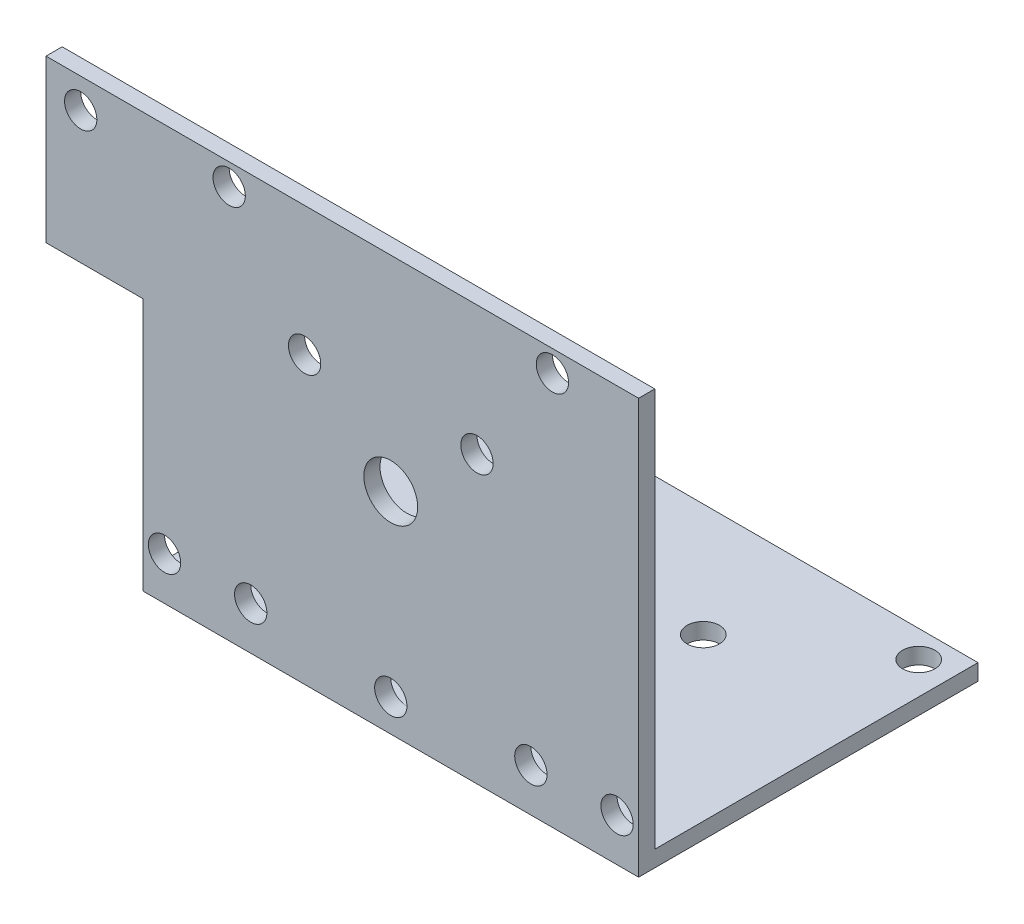
ISO-10303-21;
HEADER;
FILE_DESCRIPTION(('STEP AP214'),'2;1');
FILE_NAME('part.step','',(''),(''),'','','');
FILE_SCHEMA(('AUTOMOTIVE_DESIGN { 1 0 10303 214 1 1 1 1 }'));
ENDSEC;
DATA;
#1=APPLICATION_CONTEXT('core data for automotive mechanical design processes');
#2=APPLICATION_PROTOCOL_DEFINITION('international standard','automotive_design',2000,#1);
#3=PRODUCT_CONTEXT('',#1,'mechanical');
#4=PRODUCT('Part','Part','',(#3));
#5=PRODUCT_RELATED_PRODUCT_CATEGORY('part','',(#4));
#6=PRODUCT_DEFINITION_FORMATION('','',#4);
#7=PRODUCT_DEFINITION_CONTEXT('part definition',#1,'design');
#8=PRODUCT_DEFINITION('design','',#6,#7);
#9=PRODUCT_DEFINITION_SHAPE('','',#8);
#10=(LENGTH_UNIT() NAMED_UNIT(*) SI_UNIT(.MILLI.,.METRE.));
#11=(NAMED_UNIT(*) PLANE_ANGLE_UNIT() SI_UNIT($,.RADIAN.));
#12=(NAMED_UNIT(*) SI_UNIT($,.STERADIAN.) SOLID_ANGLE_UNIT());
#13=UNCERTAINTY_MEASURE_WITH_UNIT(LENGTH_MEASURE(1.E-05),#10,'distance_accuracy_value','');
#14=(GEOMETRIC_REPRESENTATION_CONTEXT(3) GLOBAL_UNCERTAINTY_ASSIGNED_CONTEXT((#13)) GLOBAL_UNIT_ASSIGNED_CONTEXT((#10,
#11,#12)) REPRESENTATION_CONTEXT('',''));
#15=CARTESIAN_POINT('',(0.,0.,0.));
#16=DIRECTION('',(0.,0.,1.));
#17=DIRECTION('',(1.,0.,0.));
#18=AXIS2_PLACEMENT_3D('',#15,#16,#17);
#19=CARTESIAN_POINT('',(23.,-19.25,1.5));
#20=DIRECTION('',(-1.,0.,0.));
#21=DIRECTION('',(0.,0.,1.));
#22=AXIS2_PLACEMENT_3D('',#19,#20,#21);
#23=PLANE('',#22);
#24=DIRECTION('',(0.,0.,-1.));
#25=VECTOR('',#24,1.);
#26=CARTESIAN_POINT('',(23.,-19.25,1.5));
#27=LINE('',#26,#25);
#28=CARTESIAN_POINT('',(23.,-19.25,1.5));
#29=VERTEX_POINT('',#28);
#30=CARTESIAN_POINT('',(23.,-19.25,-30.));
#31=VERTEX_POINT('',#30);
#32=EDGE_CURVE('E123',#29,#31,#27,.T.);
#33=ORIENTED_EDGE('',*,*,#32,.T.);
#34=DIRECTION('',(0.,-1.,0.));
#35=VECTOR('',#34,1.);
#36=CARTESIAN_POINT('',(23.,-19.25,-30.));
#37=LINE('',#36,#35);
#38=CARTESIAN_POINT('',(23.,-17.75,-30.));
#39=VERTEX_POINT('',#38);
#40=EDGE_CURVE('E148',#39,#31,#37,.T.);
#41=ORIENTED_EDGE('',*,*,#40,.F.);
#42=DIRECTION('',(0.,0.,1.));
#43=VECTOR('',#42,1.);
#44=CARTESIAN_POINT('',(23.,-17.75,-30.));
#45=LINE('',#44,#43);
#46=CARTESIAN_POINT('',(23.,-17.75,0.));
#47=VERTEX_POINT('',#46);
#48=EDGE_CURVE('E154',#39,#47,#45,.T.);
#49=ORIENTED_EDGE('',*,*,#48,.T.);
#50=DIRECTION('',(0.,1.,0.));
#51=VECTOR('',#50,1.);
#52=CARTESIAN_POINT('',(23.,-19.25,0.));
#53=LINE('',#52,#51);
#54=CARTESIAN_POINT('',(23.,19.25,0.));
#55=VERTEX_POINT('',#54);
#56=EDGE_CURVE('E129',#47,#55,#53,.T.);
#57=ORIENTED_EDGE('',*,*,#56,.T.);
#58=DIRECTION('',(0.,0.,-1.));
#59=VECTOR('',#58,1.);
#60=CARTESIAN_POINT('',(23.,19.25,1.5));
#61=LINE('',#60,#59);
#62=CARTESIAN_POINT('',(23.,19.25,1.5));
#63=VERTEX_POINT('',#62);
#64=EDGE_CURVE('E11',#63,#55,#61,.T.);
#65=ORIENTED_EDGE('',*,*,#64,.F.);
#66=DIRECTION('',(0.,1.,0.));
#67=VECTOR('',#66,1.);
#68=CARTESIAN_POINT('',(23.,-19.25,1.5));
#69=LINE('',#68,#67);
#70=EDGE_CURVE('E125',#29,#63,#69,.T.);
#71=ORIENTED_EDGE('',*,*,#70,.F.);
#72=EDGE_LOOP('',(#33,#41,#49,#57,#65,#71));
#73=FACE_BOUND('',#72,.T.);
#74=ADVANCED_FACE('F33',(#73),#23,.F.);
#75=CARTESIAN_POINT('',(-23.,19.25,1.5));
#76=DIRECTION('',(0.,-1.,0.));
#77=DIRECTION('',(0.,0.,-1.));
#78=AXIS2_PLACEMENT_3D('',#75,#76,#77);
#79=PLANE('',#78);
#80=DIRECTION('',(-1.,0.,0.));
#81=VECTOR('',#80,1.);
#82=CARTESIAN_POINT('',(-23.,19.25,0.));
#83=LINE('',#82,#81);
#84=CARTESIAN_POINT('',(-32.,19.25,0.));
#85=VERTEX_POINT('',#84);
#86=EDGE_CURVE('E131',#55,#85,#83,.T.);
#87=ORIENTED_EDGE('',*,*,#86,.T.);
#88=DIRECTION('',(0.,0.,-1.));
#89=VECTOR('',#88,1.);
#90=CARTESIAN_POINT('',(-32.,19.25,1.5));
#91=LINE('',#90,#89);
#92=CARTESIAN_POINT('',(-32.,19.25,1.5));
#93=VERTEX_POINT('',#92);
#94=EDGE_CURVE('E173',#93,#85,#91,.T.);
#95=ORIENTED_EDGE('',*,*,#94,.F.);
#96=DIRECTION('',(-1.,0.,0.));
#97=VECTOR('',#96,1.);
#98=CARTESIAN_POINT('',(-23.,19.25,1.5));
#99=LINE('',#98,#97);
#100=EDGE_CURVE('E121',#63,#93,#99,.T.);
#101=ORIENTED_EDGE('',*,*,#100,.F.);
#102=ORIENTED_EDGE('',*,*,#64,.T.);
#103=EDGE_LOOP('',(#87,#95,#101,#102));
#104=FACE_BOUND('',#103,.T.);
#105=ADVANCED_FACE('F171',(#104),#79,.F.);
#106=CARTESIAN_POINT('',(-23.,-19.25,1.5));
#107=DIRECTION('',(1.,0.,0.));
#108=DIRECTION('',(0.,0.,-1.));
#109=AXIS2_PLACEMENT_3D('',#106,#107,#108);
#110=PLANE('',#109);
#111=DIRECTION('',(0.,-1.,0.));
#112=VECTOR('',#111,1.);
#113=CARTESIAN_POINT('',(-23.,-19.25,1.5));
#114=LINE('',#113,#112);
#115=CARTESIAN_POINT('',(-23.,4.25,1.5));
#116=VERTEX_POINT('',#115);
#117=CARTESIAN_POINT('',(-23.,-19.25,1.5));
#118=VERTEX_POINT('',#117);
#119=EDGE_CURVE('E112',#116,#118,#114,.T.);
#120=ORIENTED_EDGE('',*,*,#119,.F.);
#121=DIRECTION('',(0.,0.,-1.));
#122=VECTOR('',#121,1.);
#123=CARTESIAN_POINT('',(-23.,4.25,1.5));
#124=LINE('',#123,#122);
#125=CARTESIAN_POINT('',(-23.,4.25,0.));
#126=VERTEX_POINT('',#125);
#127=EDGE_CURVE('E97',#116,#126,#124,.T.);
#128=ORIENTED_EDGE('',*,*,#127,.T.);
#129=DIRECTION('',(0.,-1.,0.));
#130=VECTOR('',#129,1.);
#131=CARTESIAN_POINT('',(-23.,-19.25,0.));
#132=LINE('',#131,#130);
#133=CARTESIAN_POINT('',(-23.,-17.75,0.));
#134=VERTEX_POINT('',#133);
#135=EDGE_CURVE('E134',#126,#134,#132,.T.);
#136=ORIENTED_EDGE('',*,*,#135,.T.);
#137=DIRECTION('',(0.,0.,1.));
#138=VECTOR('',#137,1.);
#139=CARTESIAN_POINT('',(-23.,-17.75,-30.));
#140=LINE('',#139,#138);
#141=CARTESIAN_POINT('',(-23.,-17.75,-30.));
#142=VERTEX_POINT('',#141);
#143=EDGE_CURVE('E132',#142,#134,#140,.T.);
#144=ORIENTED_EDGE('',*,*,#143,.F.);
#145=DIRECTION('',(0.,1.,0.));
#146=VECTOR('',#145,1.);
#147=CARTESIAN_POINT('',(-23.,-19.25,-30.));
#148=LINE('',#147,#146);
#149=CARTESIAN_POINT('',(-23.,-19.25,-30.));
#150=VERTEX_POINT('',#149);
#151=EDGE_CURVE('E145',#150,#142,#148,.T.);
#152=ORIENTED_EDGE('',*,*,#151,.F.);
#153=DIRECTION('',(0.,0.,-1.));
#154=VECTOR('',#153,1.);
#155=CARTESIAN_POINT('',(-23.,-19.25,1.5));
#156=LINE('',#155,#154);
#157=EDGE_CURVE('E40',#118,#150,#156,.T.);
#158=ORIENTED_EDGE('',*,*,#157,.F.);
#159=EDGE_LOOP('',(#120,#128,#136,#144,#152,#158));
#160=FACE_BOUND('',#159,.T.);
#161=ADVANCED_FACE('F117',(#160),#110,.F.);
#162=CARTESIAN_POINT('',(-23.,-19.25,1.5));
#163=DIRECTION('',(0.,1.,0.));
#164=DIRECTION('',(0.,0.,1.));
#165=AXIS2_PLACEMENT_3D('',#162,#163,#164);
#166=PLANE('',#165);
#167=CARTESIAN_POINT('',(-20.,-19.25,-27.5));
#168=DIRECTION('',(0.,1.,0.));
#169=DIRECTION('',(0.,0.,1.));
#170=AXIS2_PLACEMENT_3D('',#167,#168,#169);
#171=CIRCLE('',#170,1.5);
#172=CARTESIAN_POINT('',(-20.,-19.25,-26.));
#173=VERTEX_POINT('',#172);
#174=EDGE_CURVE('E256',#173,#173,#171,.F.);
#175=ORIENTED_EDGE('',*,*,#174,.F.);
#176=EDGE_LOOP('',(#175));
#177=FACE_BOUND('',#176,.T.);
#178=CARTESIAN_POINT('',(8.,-19.25,-19.5));
#179=DIRECTION('',(0.,1.,0.));
#180=DIRECTION('',(0.,0.,1.));
#181=AXIS2_PLACEMENT_3D('',#178,#179,#180);
#182=CIRCLE('',#181,1.5);
#183=CARTESIAN_POINT('',(8.,-19.25,-18.));
#184=VERTEX_POINT('',#183);
#185=EDGE_CURVE('E262',#184,#184,#182,.F.);
#186=ORIENTED_EDGE('',*,*,#185,.F.);
#187=EDGE_LOOP('',(#186));
#188=FACE_BOUND('',#187,.T.);
#189=CARTESIAN_POINT('',(-8.,-19.25,-4.5));
#190=DIRECTION('',(0.,1.,0.));
#191=DIRECTION('',(0.,0.,1.));
#192=AXIS2_PLACEMENT_3D('',#189,#190,#191);
#193=CIRCLE('',#192,1.5);
#194=CARTESIAN_POINT('',(-8.,-19.25,-3.));
#195=VERTEX_POINT('',#194);
#196=EDGE_CURVE('E263',#195,#195,#193,.F.);
#197=ORIENTED_EDGE('',*,*,#196,.F.);
#198=EDGE_LOOP('',(#197));
#199=FACE_BOUND('',#198,.T.);
#200=CARTESIAN_POINT('',(8.,-19.25,-4.5));
#201=DIRECTION('',(0.,1.,0.));
#202=DIRECTION('',(0.,0.,1.));
#203=AXIS2_PLACEMENT_3D('',#200,#201,#202);
#204=CIRCLE('',#203,1.5);
#205=CARTESIAN_POINT('',(8.,-19.25,-3.00000000000001));
#206=VERTEX_POINT('',#205);
#207=EDGE_CURVE('E248',#206,#206,#204,.F.);
#208=ORIENTED_EDGE('',*,*,#207,.F.);
#209=EDGE_LOOP('',(#208));
#210=FACE_BOUND('',#209,.T.);
#211=CARTESIAN_POINT('',(20.,-19.25,-27.5));
#212=DIRECTION('',(0.,1.,0.));
#213=DIRECTION('',(0.,0.,1.));
#214=AXIS2_PLACEMENT_3D('',#211,#212,#213);
#215=CIRCLE('',#214,1.5);
#216=CARTESIAN_POINT('',(20.,-19.25,-26.));
#217=VERTEX_POINT('',#216);
#218=EDGE_CURVE('E249',#217,#217,#215,.F.);
#219=ORIENTED_EDGE('',*,*,#218,.F.);
#220=EDGE_LOOP('',(#219));
#221=FACE_BOUND('',#220,.T.);
#222=CARTESIAN_POINT('',(-8.,-19.25,-19.5));
#223=DIRECTION('',(0.,1.,0.));
#224=DIRECTION('',(0.,0.,1.));
#225=AXIS2_PLACEMENT_3D('',#222,#223,#224);
#226=CIRCLE('',#225,1.5);
#227=CARTESIAN_POINT('',(-8.,-19.25,-18.));
#228=VERTEX_POINT('',#227);
#229=EDGE_CURVE('E277',#228,#228,#226,.F.);
#230=ORIENTED_EDGE('',*,*,#229,.F.);
#231=EDGE_LOOP('',(#230));
#232=FACE_BOUND('',#231,.T.);
#233=ORIENTED_EDGE('',*,*,#157,.T.);
#234=DIRECTION('',(-1.,0.,0.));
#235=VECTOR('',#234,1.);
#236=CARTESIAN_POINT('',(23.,-19.25,-30.));
#237=LINE('',#236,#235);
#238=EDGE_CURVE('E141',#31,#150,#237,.T.);
#239=ORIENTED_EDGE('',*,*,#238,.F.);
#240=ORIENTED_EDGE('',*,*,#32,.F.);
#241=DIRECTION('',(1.,0.,0.));
#242=VECTOR('',#241,1.);
#243=CARTESIAN_POINT('',(-23.,-19.25,1.5));
#244=LINE('',#243,#242);
#245=EDGE_CURVE('E120',#118,#29,#244,.T.);
#246=ORIENTED_EDGE('',*,*,#245,.F.);
#247=EDGE_LOOP('',(#233,#239,#240,#246));
#248=FACE_BOUND('',#247,.T.);
#249=ADVANCED_FACE('F139',(#177,#188,#199,#210,#221,#232,#248),#166,.F.);
#250=CARTESIAN_POINT('',(0.,0.,1.5));
#251=DIRECTION('',(0.,0.,-1.));
#252=DIRECTION('',(-1.,0.,0.));
#253=AXIS2_PLACEMENT_3D('',#250,#251,#252);
#254=PLANE('',#253);
#255=CARTESIAN_POINT('',(0.,0.250000000000004,1.5));
#256=DIRECTION('',(0.,0.,1.));
#257=DIRECTION('',(1.,0.,0.));
#258=AXIS2_PLACEMENT_3D('',#255,#256,#257);
#259=CIRCLE('',#258,2.5);
#260=CARTESIAN_POINT('',(2.50000000000001,0.250000000000004,1.5));
#261=VERTEX_POINT('',#260);
#262=EDGE_CURVE('E200',#261,#261,#259,.T.);
#263=ORIENTED_EDGE('',*,*,#262,.F.);
#264=EDGE_LOOP('',(#263));
#265=FACE_BOUND('',#264,.T.);
#266=CARTESIAN_POINT('',(8.,7.25000000000001,1.5));
#267=DIRECTION('',(0.,0.,1.));
#268=DIRECTION('',(-1.,0.,0.));
#269=AXIS2_PLACEMENT_3D('',#266,#267,#268);
#270=CIRCLE('',#269,1.5);
#271=CARTESIAN_POINT('',(6.5,7.25000000000001,1.5));
#272=VERTEX_POINT('',#271);
#273=EDGE_CURVE('E193',#272,#272,#270,.T.);
#274=ORIENTED_EDGE('',*,*,#273,.F.);
#275=EDGE_LOOP('',(#274));
#276=FACE_BOUND('',#275,.T.);
#277=CARTESIAN_POINT('',(-8.,7.25,1.5));
#278=DIRECTION('',(0.,0.,1.));
#279=DIRECTION('',(1.,0.,0.));
#280=AXIS2_PLACEMENT_3D('',#277,#278,#279);
#281=CIRCLE('',#280,1.5);
#282=CARTESIAN_POINT('',(-6.5,7.25,1.5));
#283=VERTEX_POINT('',#282);
#284=EDGE_CURVE('E214',#283,#283,#281,.T.);
#285=ORIENTED_EDGE('',*,*,#284,.F.);
#286=EDGE_LOOP('',(#285));
#287=FACE_BOUND('',#286,.T.);
#288=CARTESIAN_POINT('',(15.,17.25,1.5));
#289=DIRECTION('',(0.,0.,1.));
#290=DIRECTION('',(1.,0.,0.));
#291=AXIS2_PLACEMENT_3D('',#288,#289,#290);
#292=CIRCLE('',#291,1.5);
#293=CARTESIAN_POINT('',(16.5,17.25,1.5));
#294=VERTEX_POINT('',#293);
#295=EDGE_CURVE('E207',#294,#294,#292,.T.);
#296=ORIENTED_EDGE('',*,*,#295,.F.);
#297=EDGE_LOOP('',(#296));
#298=FACE_BOUND('',#297,.T.);
#299=CARTESIAN_POINT('',(-13.,-15.25,1.5));
#300=DIRECTION('',(0.,0.,1.));
#301=DIRECTION('',(1.,0.,0.));
#302=AXIS2_PLACEMENT_3D('',#299,#300,#301);
#303=CIRCLE('',#302,1.5);
#304=CARTESIAN_POINT('',(-11.5,-15.25,1.5));
#305=VERTEX_POINT('',#304);
#306=EDGE_CURVE('E226',#305,#305,#303,.T.);
#307=ORIENTED_EDGE('',*,*,#306,.F.);
#308=EDGE_LOOP('',(#307));
#309=FACE_BOUND('',#308,.T.);
#310=CARTESIAN_POINT('',(21.,-15.25,1.5));
#311=DIRECTION('',(0.,0.,1.));
#312=DIRECTION('',(-1.,0.,0.));
#313=AXIS2_PLACEMENT_3D('',#310,#311,#312);
#314=CIRCLE('',#313,1.5);
#315=CARTESIAN_POINT('',(19.5,-15.25,1.5));
#316=VERTEX_POINT('',#315);
#317=EDGE_CURVE('E219',#316,#316,#314,.T.);
#318=ORIENTED_EDGE('',*,*,#317,.F.);
#319=EDGE_LOOP('',(#318));
#320=FACE_BOUND('',#319,.T.);
#321=CARTESIAN_POINT('',(-21.,-15.25,1.5));
#322=DIRECTION('',(0.,0.,1.));
#323=DIRECTION('',(1.,0.,0.));
#324=AXIS2_PLACEMENT_3D('',#321,#322,#323);
#325=CIRCLE('',#324,1.5);
#326=CARTESIAN_POINT('',(-19.5,-15.25,1.5));
#327=VERTEX_POINT('',#326);
#328=EDGE_CURVE('E234',#327,#327,#325,.T.);
#329=ORIENTED_EDGE('',*,*,#328,.F.);
#330=EDGE_LOOP('',(#329));
#331=FACE_BOUND('',#330,.T.);
#332=CARTESIAN_POINT('',(0.,-16.25,1.5));
#333=DIRECTION('',(0.,0.,1.));
#334=DIRECTION('',(1.,0.,0.));
#335=AXIS2_PLACEMENT_3D('',#332,#333,#334);
#336=CIRCLE('',#335,1.5);
#337=CARTESIAN_POINT('',(1.5,-16.25,1.5));
#338=VERTEX_POINT('',#337);
#339=EDGE_CURVE('E206',#338,#338,#336,.T.);
#340=ORIENTED_EDGE('',*,*,#339,.F.);
#341=EDGE_LOOP('',(#340));
#342=FACE_BOUND('',#341,.T.);
#343=CARTESIAN_POINT('',(13.,-15.25,1.5));
#344=DIRECTION('',(0.,0.,1.));
#345=DIRECTION('',(-1.,0.,0.));
#346=AXIS2_PLACEMENT_3D('',#343,#344,#345);
#347=CIRCLE('',#346,1.5);
#348=CARTESIAN_POINT('',(11.5,-15.25,1.5));
#349=VERTEX_POINT('',#348);
#350=EDGE_CURVE('E187',#349,#349,#347,.T.);
#351=ORIENTED_EDGE('',*,*,#350,.F.);
#352=EDGE_LOOP('',(#351));
#353=FACE_BOUND('',#352,.T.);
#354=CARTESIAN_POINT('',(-15.,17.25,1.5));
#355=DIRECTION('',(0.,0.,1.));
#356=DIRECTION('',(1.,0.,0.));
#357=AXIS2_PLACEMENT_3D('',#354,#355,#356);
#358=CIRCLE('',#357,1.5);
#359=CARTESIAN_POINT('',(-13.5,17.25,1.5));
#360=VERTEX_POINT('',#359);
#361=EDGE_CURVE('E239',#360,#360,#358,.T.);
#362=ORIENTED_EDGE('',*,*,#361,.F.);
#363=EDGE_LOOP('',(#362));
#364=FACE_BOUND('',#363,.T.);
#365=ORIENTED_EDGE('',*,*,#70,.T.);
#366=ORIENTED_EDGE('',*,*,#100,.T.);
#367=DIRECTION('',(0.,1.,0.));
#368=VECTOR('',#367,1.);
#369=CARTESIAN_POINT('',(-32.,19.25,1.5));
#370=LINE('',#369,#368);
#371=CARTESIAN_POINT('',(-32.,4.25,1.5));
#372=VERTEX_POINT('',#371);
#373=EDGE_CURVE('E105',#372,#93,#370,.T.);
#374=ORIENTED_EDGE('',*,*,#373,.F.);
#375=DIRECTION('',(-1.,0.,0.));
#376=VECTOR('',#375,1.);
#377=CARTESIAN_POINT('',(-23.,4.25,1.5));
#378=LINE('',#377,#376);
#379=EDGE_CURVE('E100',#116,#372,#378,.T.);
#380=ORIENTED_EDGE('',*,*,#379,.F.);
#381=ORIENTED_EDGE('',*,*,#119,.T.);
#382=ORIENTED_EDGE('',*,*,#245,.T.);
#383=EDGE_LOOP('',(#365,#366,#374,#380,#381,#382));
#384=FACE_BOUND('',#383,.T.);
#385=CARTESIAN_POINT('',(-28.7800000000029,16.5,1.5));
#386=DIRECTION('',(0.,0.,-1.));
#387=DIRECTION('',(-1.,0.,0.));
#388=AXIS2_PLACEMENT_3D('',#385,#386,#387);
#389=CIRCLE('',#388,1.49999999999729);
#390=CARTESIAN_POINT('',(-30.2800000000001,16.5,1.5));
#391=VERTEX_POINT('',#390);
#392=EDGE_CURVE('E184',#391,#391,#389,.T.);
#393=ORIENTED_EDGE('',*,*,#392,.T.);
#394=EDGE_LOOP('',(#393));
#395=FACE_BOUND('',#394,.T.);
#396=ADVANCED_FACE('F110',(#265,#276,#287,#298,#309,#320,#331,#342,#353,#364,#384,#395),#254,.F.);
#397=CARTESIAN_POINT('',(0.,0.,0.));
#398=DIRECTION('',(0.,0.,-1.));
#399=DIRECTION('',(-1.,0.,0.));
#400=AXIS2_PLACEMENT_3D('',#397,#398,#399);
#401=PLANE('',#400);
#402=CARTESIAN_POINT('',(0.,0.250000000000004,0.));
#403=DIRECTION('',(0.,0.,-1.));
#404=DIRECTION('',(-1.,0.,0.));
#405=AXIS2_PLACEMENT_3D('',#402,#403,#404);
#406=CIRCLE('',#405,2.5);
#407=CARTESIAN_POINT('',(-2.49999999999999,0.250000000000004,0.));
#408=VERTEX_POINT('',#407);
#409=EDGE_CURVE('E203',#408,#408,#406,.F.);
#410=ORIENTED_EDGE('',*,*,#409,.T.);
#411=EDGE_LOOP('',(#410));
#412=FACE_BOUND('',#411,.T.);
#413=CARTESIAN_POINT('',(8.,7.25000000000001,0.));
#414=DIRECTION('',(0.,0.,-1.));
#415=DIRECTION('',(-1.,0.,0.));
#416=AXIS2_PLACEMENT_3D('',#413,#414,#415);
#417=CIRCLE('',#416,1.5);
#418=CARTESIAN_POINT('',(6.5,7.25000000000001,0.));
#419=VERTEX_POINT('',#418);
#420=EDGE_CURVE('E197',#419,#419,#417,.F.);
#421=ORIENTED_EDGE('',*,*,#420,.T.);
#422=EDGE_LOOP('',(#421));
#423=FACE_BOUND('',#422,.T.);
#424=CARTESIAN_POINT('',(-8.,7.25,0.));
#425=DIRECTION('',(0.,0.,-1.));
#426=DIRECTION('',(-1.,0.,0.));
#427=AXIS2_PLACEMENT_3D('',#424,#425,#426);
#428=CIRCLE('',#427,1.5);
#429=CARTESIAN_POINT('',(-9.5,7.25,0.));
#430=VERTEX_POINT('',#429);
#431=EDGE_CURVE('E196',#430,#430,#428,.F.);
#432=ORIENTED_EDGE('',*,*,#431,.T.);
#433=EDGE_LOOP('',(#432));
#434=FACE_BOUND('',#433,.T.);
#435=CARTESIAN_POINT('',(15.,17.25,0.));
#436=DIRECTION('',(0.,0.,-1.));
#437=DIRECTION('',(-1.,0.,0.));
#438=AXIS2_PLACEMENT_3D('',#435,#436,#437);
#439=CIRCLE('',#438,1.5);
#440=CARTESIAN_POINT('',(13.5,17.25,0.));
#441=VERTEX_POINT('',#440);
#442=EDGE_CURVE('E211',#441,#441,#439,.F.);
#443=ORIENTED_EDGE('',*,*,#442,.T.);
#444=EDGE_LOOP('',(#443));
#445=FACE_BOUND('',#444,.T.);
#446=CARTESIAN_POINT('',(-13.,-15.25,0.));
#447=DIRECTION('',(0.,0.,-1.));
#448=DIRECTION('',(-1.,0.,0.));
#449=AXIS2_PLACEMENT_3D('',#446,#447,#448);
#450=CIRCLE('',#449,1.5);
#451=CARTESIAN_POINT('',(-14.5,-15.25,0.));
#452=VERTEX_POINT('',#451);
#453=EDGE_CURVE('E190',#452,#452,#450,.F.);
#454=ORIENTED_EDGE('',*,*,#453,.T.);
#455=EDGE_LOOP('',(#454));
#456=FACE_BOUND('',#455,.T.);
#457=CARTESIAN_POINT('',(21.,-15.25,0.));
#458=DIRECTION('',(0.,0.,-1.));
#459=DIRECTION('',(-1.,0.,0.));
#460=AXIS2_PLACEMENT_3D('',#457,#458,#459);
#461=CIRCLE('',#460,1.5);
#462=CARTESIAN_POINT('',(19.5,-15.25,0.));
#463=VERTEX_POINT('',#462);
#464=EDGE_CURVE('E223',#463,#463,#461,.F.);
#465=ORIENTED_EDGE('',*,*,#464,.T.);
#466=EDGE_LOOP('',(#465));
#467=FACE_BOUND('',#466,.T.);
#468=CARTESIAN_POINT('',(-21.,-15.25,0.));
#469=DIRECTION('',(0.,0.,-1.));
#470=DIRECTION('',(-1.,0.,0.));
#471=AXIS2_PLACEMENT_3D('',#468,#469,#470);
#472=CIRCLE('',#471,1.5);
#473=CARTESIAN_POINT('',(-22.5,-15.25,0.));
#474=VERTEX_POINT('',#473);
#475=EDGE_CURVE('E222',#474,#474,#472,.F.);
#476=ORIENTED_EDGE('',*,*,#475,.T.);
#477=EDGE_LOOP('',(#476));
#478=FACE_BOUND('',#477,.T.);
#479=CARTESIAN_POINT('',(13.,-15.25,0.));
#480=DIRECTION('',(0.,0.,-1.));
#481=DIRECTION('',(-1.,0.,0.));
#482=AXIS2_PLACEMENT_3D('',#479,#480,#481);
#483=CIRCLE('',#482,1.5);
#484=CARTESIAN_POINT('',(11.5,-15.25,0.));
#485=VERTEX_POINT('',#484);
#486=EDGE_CURVE('E177',#485,#485,#483,.F.);
#487=ORIENTED_EDGE('',*,*,#486,.T.);
#488=EDGE_LOOP('',(#487));
#489=FACE_BOUND('',#488,.T.);
#490=CARTESIAN_POINT('',(-15.,17.25,0.));
#491=DIRECTION('',(0.,0.,-1.));
#492=DIRECTION('',(-1.,0.,0.));
#493=AXIS2_PLACEMENT_3D('',#490,#491,#492);
#494=CIRCLE('',#493,1.5);
#495=CARTESIAN_POINT('',(-16.5,17.25,0.));
#496=VERTEX_POINT('',#495);
#497=EDGE_CURVE('E210',#496,#496,#494,.F.);
#498=ORIENTED_EDGE('',*,*,#497,.T.);
#499=EDGE_LOOP('',(#498));
#500=FACE_BOUND('',#499,.T.);
#501=DIRECTION('',(1.,0.,0.));
#502=VECTOR('',#501,1.);
#503=CARTESIAN_POINT('',(23.,-17.75,0.));
#504=LINE('',#503,#502);
#505=CARTESIAN_POINT('',(0.,-17.75,0.));
#506=VERTEX_POINT('',#505);
#507=EDGE_CURVE('E161',#506,#47,#504,.T.);
#508=ORIENTED_EDGE('',*,*,#507,.F.);
#509=CARTESIAN_POINT('',(0.,-16.25,0.));
#510=DIRECTION('',(0.,0.,-1.));
#511=DIRECTION('',(-1.,0.,0.));
#512=AXIS2_PLACEMENT_3D('',#509,#510,#511);
#513=CIRCLE('',#512,1.5);
#514=EDGE_CURVE('E53',#506,#506,#513,.F.);
#515=ORIENTED_EDGE('',*,*,#514,.T.);
#516=EDGE_CURVE('E158',#134,#506,#504,.T.);
#517=ORIENTED_EDGE('',*,*,#516,.F.);
#518=ORIENTED_EDGE('',*,*,#135,.F.);
#519=DIRECTION('',(-1.,0.,0.));
#520=VECTOR('',#519,1.);
#521=CARTESIAN_POINT('',(-23.,4.25,0.));
#522=LINE('',#521,#520);
#523=CARTESIAN_POINT('',(-32.,4.25,0.));
#524=VERTEX_POINT('',#523);
#525=EDGE_CURVE('E47',#126,#524,#522,.T.);
#526=ORIENTED_EDGE('',*,*,#525,.T.);
#527=DIRECTION('',(0.,1.,0.));
#528=VECTOR('',#527,1.);
#529=CARTESIAN_POINT('',(-32.,19.25,0.));
#530=LINE('',#529,#528);
#531=EDGE_CURVE('E115',#524,#85,#530,.T.);
#532=ORIENTED_EDGE('',*,*,#531,.T.);
#533=ORIENTED_EDGE('',*,*,#86,.F.);
#534=ORIENTED_EDGE('',*,*,#56,.F.);
#535=EDGE_LOOP('',(#508,#515,#517,#518,#526,#532,#533,#534));
#536=FACE_BOUND('',#535,.T.);
#537=CARTESIAN_POINT('',(-28.7800000000029,16.5,0.));
#538=DIRECTION('',(0.,0.,-1.));
#539=DIRECTION('',(-1.,0.,0.));
#540=AXIS2_PLACEMENT_3D('',#537,#538,#539);
#541=CIRCLE('',#540,1.49999999999729);
#542=CARTESIAN_POINT('',(-30.2800000000001,16.5,0.));
#543=VERTEX_POINT('',#542);
#544=EDGE_CURVE('E294',#543,#543,#541,.T.);
#545=ORIENTED_EDGE('',*,*,#544,.F.);
#546=EDGE_LOOP('',(#545));
#547=FACE_BOUND('',#546,.T.);
#548=ADVANCED_FACE('F287',(#412,#423,#434,#445,#456,#467,#478,#489,#500,#536,#547),#401,.T.);
#549=CARTESIAN_POINT('',(23.,-17.75,-30.));
#550=DIRECTION('',(0.,-1.,0.));
#551=DIRECTION('',(0.,0.,-1.));
#552=AXIS2_PLACEMENT_3D('',#549,#550,#551);
#553=PLANE('',#552);
#554=CARTESIAN_POINT('',(-20.,-17.75,-27.5));
#555=DIRECTION('',(0.,1.,0.));
#556=DIRECTION('',(-1.,0.,0.));
#557=AXIS2_PLACEMENT_3D('',#554,#555,#556);
#558=CIRCLE('',#557,1.5);
#559=CARTESIAN_POINT('',(-21.5,-17.75,-27.5));
#560=VERTEX_POINT('',#559);
#561=EDGE_CURVE('E242',#560,#560,#558,.T.);
#562=ORIENTED_EDGE('',*,*,#561,.F.);
#563=EDGE_LOOP('',(#562));
#564=FACE_BOUND('',#563,.T.);
#565=CARTESIAN_POINT('',(8.,-17.75,-19.5));
#566=DIRECTION('',(0.,1.,0.));
#567=DIRECTION('',(-1.,0.,0.));
#568=AXIS2_PLACEMENT_3D('',#565,#566,#567);
#569=CIRCLE('',#568,1.5);
#570=CARTESIAN_POINT('',(6.5,-17.75,-19.5));
#571=VERTEX_POINT('',#570);
#572=EDGE_CURVE('E259',#571,#571,#569,.T.);
#573=ORIENTED_EDGE('',*,*,#572,.F.);
#574=EDGE_LOOP('',(#573));
#575=FACE_BOUND('',#574,.T.);
#576=CARTESIAN_POINT('',(-8.,-17.75,-4.5));
#577=DIRECTION('',(0.,1.,0.));
#578=DIRECTION('',(-1.,0.,0.));
#579=AXIS2_PLACEMENT_3D('',#576,#577,#578);
#580=CIRCLE('',#579,1.5);
#581=CARTESIAN_POINT('',(-9.5,-17.75,-4.5));
#582=VERTEX_POINT('',#581);
#583=EDGE_CURVE('E252',#582,#582,#580,.T.);
#584=ORIENTED_EDGE('',*,*,#583,.F.);
#585=EDGE_LOOP('',(#584));
#586=FACE_BOUND('',#585,.T.);
#587=CARTESIAN_POINT('',(8.,-17.75,-4.5));
#588=DIRECTION('',(0.,1.,0.));
#589=DIRECTION('',(-1.,0.,0.));
#590=AXIS2_PLACEMENT_3D('',#587,#588,#589);
#591=CIRCLE('',#590,1.5);
#592=CARTESIAN_POINT('',(6.5,-17.75,-4.5));
#593=VERTEX_POINT('',#592);
#594=EDGE_CURVE('E245',#593,#593,#591,.T.);
#595=ORIENTED_EDGE('',*,*,#594,.F.);
#596=EDGE_LOOP('',(#595));
#597=FACE_BOUND('',#596,.T.);
#598=CARTESIAN_POINT('',(20.,-17.75,-27.5));
#599=DIRECTION('',(0.,1.,0.));
#600=DIRECTION('',(-1.,0.,0.));
#601=AXIS2_PLACEMENT_3D('',#598,#599,#600);
#602=CIRCLE('',#601,1.5);
#603=CARTESIAN_POINT('',(18.5,-17.75,-27.5));
#604=VERTEX_POINT('',#603);
#605=EDGE_CURVE('E253',#604,#604,#602,.T.);
#606=ORIENTED_EDGE('',*,*,#605,.F.);
#607=EDGE_LOOP('',(#606));
#608=FACE_BOUND('',#607,.T.);
#609=CARTESIAN_POINT('',(-8.,-17.75,-19.5));
#610=DIRECTION('',(0.,1.,0.));
#611=DIRECTION('',(-1.,0.,0.));
#612=AXIS2_PLACEMENT_3D('',#609,#610,#611);
#613=CIRCLE('',#612,1.5);
#614=CARTESIAN_POINT('',(-9.5,-17.75,-19.5));
#615=VERTEX_POINT('',#614);
#616=EDGE_CURVE('E266',#615,#615,#613,.T.);
#617=ORIENTED_EDGE('',*,*,#616,.F.);
#618=EDGE_LOOP('',(#617));
#619=FACE_BOUND('',#618,.T.);
#620=ORIENTED_EDGE('',*,*,#516,.T.);
#621=ORIENTED_EDGE('',*,*,#507,.T.);
#622=ORIENTED_EDGE('',*,*,#48,.F.);
#623=DIRECTION('',(1.,0.,0.));
#624=VECTOR('',#623,1.);
#625=CARTESIAN_POINT('',(23.,-17.75,-30.));
#626=LINE('',#625,#624);
#627=EDGE_CURVE('E152',#142,#39,#626,.T.);
#628=ORIENTED_EDGE('',*,*,#627,.F.);
#629=ORIENTED_EDGE('',*,*,#143,.T.);
#630=EDGE_LOOP('',(#620,#621,#622,#628,#629));
#631=FACE_BOUND('',#630,.T.);
#632=ADVANCED_FACE('F284',(#564,#575,#586,#597,#608,#619,#631),#553,.F.);
#633=CARTESIAN_POINT('',(0.,0.,-30.));
#634=DIRECTION('',(0.,0.,1.));
#635=DIRECTION('',(1.,0.,0.));
#636=AXIS2_PLACEMENT_3D('',#633,#634,#635);
#637=PLANE('',#636);
#638=ORIENTED_EDGE('',*,*,#40,.T.);
#639=ORIENTED_EDGE('',*,*,#238,.T.);
#640=ORIENTED_EDGE('',*,*,#151,.T.);
#641=ORIENTED_EDGE('',*,*,#627,.T.);
#642=EDGE_LOOP('',(#638,#639,#640,#641));
#643=FACE_BOUND('',#642,.T.);
#644=ADVANCED_FACE('F144',(#643),#637,.F.);
#645=CARTESIAN_POINT('',(-8.,-19.251,-19.5));
#646=DIRECTION('',(0.,1.,0.));
#647=DIRECTION('',(-1.,0.,0.));
#648=AXIS2_PLACEMENT_3D('',#645,#646,#647);
#649=CYLINDRICAL_SURFACE('',#648,1.5);
#650=ORIENTED_EDGE('',*,*,#616,.T.);
#651=EDGE_LOOP('',(#650));
#652=FACE_BOUND('',#651,.T.);
#653=ORIENTED_EDGE('',*,*,#229,.T.);
#654=EDGE_LOOP('',(#653));
#655=FACE_BOUND('',#654,.T.);
#656=ADVANCED_FACE('F328',(#652,#655),#649,.F.);
#657=CARTESIAN_POINT('',(20.,-19.251,-27.5));
#658=DIRECTION('',(0.,1.,0.));
#659=DIRECTION('',(-1.,0.,0.));
#660=AXIS2_PLACEMENT_3D('',#657,#658,#659);
#661=CYLINDRICAL_SURFACE('',#660,1.5);
#662=ORIENTED_EDGE('',*,*,#605,.T.);
#663=EDGE_LOOP('',(#662));
#664=FACE_BOUND('',#663,.T.);
#665=ORIENTED_EDGE('',*,*,#218,.T.);
#666=EDGE_LOOP('',(#665));
#667=FACE_BOUND('',#666,.T.);
#668=ADVANCED_FACE('F331',(#664,#667),#661,.F.);
#669=CARTESIAN_POINT('',(8.,-19.251,-4.5));
#670=DIRECTION('',(0.,1.,0.));
#671=DIRECTION('',(-1.,0.,0.));
#672=AXIS2_PLACEMENT_3D('',#669,#670,#671);
#673=CYLINDRICAL_SURFACE('',#672,1.5);
#674=ORIENTED_EDGE('',*,*,#594,.T.);
#675=EDGE_LOOP('',(#674));
#676=FACE_BOUND('',#675,.T.);
#677=ORIENTED_EDGE('',*,*,#207,.T.);
#678=EDGE_LOOP('',(#677));
#679=FACE_BOUND('',#678,.T.);
#680=ADVANCED_FACE('F342',(#676,#679),#673,.F.);
#681=CARTESIAN_POINT('',(-8.,-19.251,-4.5));
#682=DIRECTION('',(0.,1.,0.));
#683=DIRECTION('',(-1.,0.,0.));
#684=AXIS2_PLACEMENT_3D('',#681,#682,#683);
#685=CYLINDRICAL_SURFACE('',#684,1.5);
#686=ORIENTED_EDGE('',*,*,#583,.T.);
#687=EDGE_LOOP('',(#686));
#688=FACE_BOUND('',#687,.T.);
#689=ORIENTED_EDGE('',*,*,#196,.T.);
#690=EDGE_LOOP('',(#689));
#691=FACE_BOUND('',#690,.T.);
#692=ADVANCED_FACE('F339',(#688,#691),#685,.F.);
#693=CARTESIAN_POINT('',(8.,-19.251,-19.5));
#694=DIRECTION('',(0.,1.,0.));
#695=DIRECTION('',(-1.,0.,0.));
#696=AXIS2_PLACEMENT_3D('',#693,#694,#695);
#697=CYLINDRICAL_SURFACE('',#696,1.5);
#698=ORIENTED_EDGE('',*,*,#572,.T.);
#699=EDGE_LOOP('',(#698));
#700=FACE_BOUND('',#699,.T.);
#701=ORIENTED_EDGE('',*,*,#185,.T.);
#702=EDGE_LOOP('',(#701));
#703=FACE_BOUND('',#702,.T.);
#704=ADVANCED_FACE('F337',(#700,#703),#697,.F.);
#705=CARTESIAN_POINT('',(-20.,-19.251,-27.5));
#706=DIRECTION('',(0.,1.,0.));
#707=DIRECTION('',(-1.,0.,0.));
#708=AXIS2_PLACEMENT_3D('',#705,#706,#707);
#709=CYLINDRICAL_SURFACE('',#708,1.5);
#710=ORIENTED_EDGE('',*,*,#561,.T.);
#711=EDGE_LOOP('',(#710));
#712=FACE_BOUND('',#711,.T.);
#713=ORIENTED_EDGE('',*,*,#174,.T.);
#714=EDGE_LOOP('',(#713));
#715=FACE_BOUND('',#714,.T.);
#716=ADVANCED_FACE('F333',(#712,#715),#709,.F.);
#717=CARTESIAN_POINT('',(-15.,17.25,-30.001));
#718=DIRECTION('',(0.,0.,1.));
#719=DIRECTION('',(1.,0.,0.));
#720=AXIS2_PLACEMENT_3D('',#717,#718,#719);
#721=CYLINDRICAL_SURFACE('',#720,1.5);
#722=ORIENTED_EDGE('',*,*,#497,.F.);
#723=EDGE_LOOP('',(#722));
#724=FACE_BOUND('',#723,.T.);
#725=ORIENTED_EDGE('',*,*,#361,.T.);
#726=EDGE_LOOP('',(#725));
#727=FACE_BOUND('',#726,.T.);
#728=ADVANCED_FACE('F336',(#724,#727),#721,.F.);
#729=CARTESIAN_POINT('',(13.,-15.25,-30.001));
#730=DIRECTION('',(0.,0.,1.));
#731=DIRECTION('',(1.,0.,0.));
#732=AXIS2_PLACEMENT_3D('',#729,#730,#731);
#733=CYLINDRICAL_SURFACE('',#732,1.5);
#734=ORIENTED_EDGE('',*,*,#486,.F.);
#735=EDGE_LOOP('',(#734));
#736=FACE_BOUND('',#735,.T.);
#737=ORIENTED_EDGE('',*,*,#350,.T.);
#738=EDGE_LOOP('',(#737));
#739=FACE_BOUND('',#738,.T.);
#740=ADVANCED_FACE('F355',(#736,#739),#733,.F.);
#741=CARTESIAN_POINT('',(0.,-16.25,-30.001));
#742=DIRECTION('',(0.,0.,1.));
#743=DIRECTION('',(1.,0.,0.));
#744=AXIS2_PLACEMENT_3D('',#741,#742,#743);
#745=CYLINDRICAL_SURFACE('',#744,1.5);
#746=ORIENTED_EDGE('',*,*,#514,.F.);
#747=EDGE_LOOP('',(#746));
#748=FACE_BOUND('',#747,.T.);
#749=ORIENTED_EDGE('',*,*,#339,.T.);
#750=EDGE_LOOP('',(#749));
#751=FACE_BOUND('',#750,.T.);
#752=ADVANCED_FACE('F361',(#748,#751),#745,.F.);
#753=CARTESIAN_POINT('',(-21.,-15.25,-30.001));
#754=DIRECTION('',(0.,0.,1.));
#755=DIRECTION('',(1.,0.,0.));
#756=AXIS2_PLACEMENT_3D('',#753,#754,#755);
#757=CYLINDRICAL_SURFACE('',#756,1.5);
#758=ORIENTED_EDGE('',*,*,#475,.F.);
#759=EDGE_LOOP('',(#758));
#760=FACE_BOUND('',#759,.T.);
#761=ORIENTED_EDGE('',*,*,#328,.T.);
#762=EDGE_LOOP('',(#761));
#763=FACE_BOUND('',#762,.T.);
#764=ADVANCED_FACE('F357',(#760,#763),#757,.F.);
#765=CARTESIAN_POINT('',(21.,-15.25,-30.001));
#766=DIRECTION('',(0.,0.,1.));
#767=DIRECTION('',(1.,0.,0.));
#768=AXIS2_PLACEMENT_3D('',#765,#766,#767);
#769=CYLINDRICAL_SURFACE('',#768,1.5);
#770=ORIENTED_EDGE('',*,*,#464,.F.);
#771=EDGE_LOOP('',(#770));
#772=FACE_BOUND('',#771,.T.);
#773=ORIENTED_EDGE('',*,*,#317,.T.);
#774=EDGE_LOOP('',(#773));
#775=FACE_BOUND('',#774,.T.);
#776=ADVANCED_FACE('F360',(#772,#775),#769,.F.);
#777=CARTESIAN_POINT('',(-13.,-15.25,-30.001));
#778=DIRECTION('',(0.,0.,1.));
#779=DIRECTION('',(1.,0.,0.));
#780=AXIS2_PLACEMENT_3D('',#777,#778,#779);
#781=CYLINDRICAL_SURFACE('',#780,1.5);
#782=ORIENTED_EDGE('',*,*,#453,.F.);
#783=EDGE_LOOP('',(#782));
#784=FACE_BOUND('',#783,.T.);
#785=ORIENTED_EDGE('',*,*,#306,.T.);
#786=EDGE_LOOP('',(#785));
#787=FACE_BOUND('',#786,.T.);
#788=ADVANCED_FACE('F365',(#784,#787),#781,.F.);
#789=CARTESIAN_POINT('',(15.,17.25,-30.001));
#790=DIRECTION('',(0.,0.,1.));
#791=DIRECTION('',(1.,0.,0.));
#792=AXIS2_PLACEMENT_3D('',#789,#790,#791);
#793=CYLINDRICAL_SURFACE('',#792,1.5);
#794=ORIENTED_EDGE('',*,*,#442,.F.);
#795=EDGE_LOOP('',(#794));
#796=FACE_BOUND('',#795,.T.);
#797=ORIENTED_EDGE('',*,*,#295,.T.);
#798=EDGE_LOOP('',(#797));
#799=FACE_BOUND('',#798,.T.);
#800=ADVANCED_FACE('F368',(#796,#799),#793,.F.);
#801=CARTESIAN_POINT('',(-8.,7.25,-30.001));
#802=DIRECTION('',(0.,0.,1.));
#803=DIRECTION('',(1.,0.,0.));
#804=AXIS2_PLACEMENT_3D('',#801,#802,#803);
#805=CYLINDRICAL_SURFACE('',#804,1.5);
#806=ORIENTED_EDGE('',*,*,#431,.F.);
#807=EDGE_LOOP('',(#806));
#808=FACE_BOUND('',#807,.T.);
#809=ORIENTED_EDGE('',*,*,#284,.T.);
#810=EDGE_LOOP('',(#809));
#811=FACE_BOUND('',#810,.T.);
#812=ADVANCED_FACE('F373',(#808,#811),#805,.F.);
#813=CARTESIAN_POINT('',(8.,7.25000000000001,-30.001));
#814=DIRECTION('',(0.,0.,1.));
#815=DIRECTION('',(1.,0.,0.));
#816=AXIS2_PLACEMENT_3D('',#813,#814,#815);
#817=CYLINDRICAL_SURFACE('',#816,1.5);
#818=ORIENTED_EDGE('',*,*,#420,.F.);
#819=EDGE_LOOP('',(#818));
#820=FACE_BOUND('',#819,.T.);
#821=ORIENTED_EDGE('',*,*,#273,.T.);
#822=EDGE_LOOP('',(#821));
#823=FACE_BOUND('',#822,.T.);
#824=ADVANCED_FACE('F376',(#820,#823),#817,.F.);
#825=CARTESIAN_POINT('',(0.,0.250000000000004,-30.001));
#826=DIRECTION('',(0.,0.,1.));
#827=DIRECTION('',(1.,0.,0.));
#828=AXIS2_PLACEMENT_3D('',#825,#826,#827);
#829=CYLINDRICAL_SURFACE('',#828,2.5);
#830=ORIENTED_EDGE('',*,*,#409,.F.);
#831=EDGE_LOOP('',(#830));
#832=FACE_BOUND('',#831,.T.);
#833=ORIENTED_EDGE('',*,*,#262,.T.);
#834=EDGE_LOOP('',(#833));
#835=FACE_BOUND('',#834,.T.);
#836=ADVANCED_FACE('F381',(#832,#835),#829,.F.);
#837=CARTESIAN_POINT('',(-32.,19.25,1.5));
#838=DIRECTION('',(-1.,0.,0.));
#839=DIRECTION('',(0.,-1.,0.));
#840=AXIS2_PLACEMENT_3D('',#837,#838,#839);
#841=PLANE('',#840);
#842=ORIENTED_EDGE('',*,*,#531,.F.);
#843=DIRECTION('',(0.,0.,-1.));
#844=VECTOR('',#843,1.);
#845=CARTESIAN_POINT('',(-32.,4.25,1.5));
#846=LINE('',#845,#844);
#847=EDGE_CURVE('E104',#372,#524,#846,.T.);
#848=ORIENTED_EDGE('',*,*,#847,.F.);
#849=ORIENTED_EDGE('',*,*,#373,.T.);
#850=ORIENTED_EDGE('',*,*,#94,.T.);
#851=EDGE_LOOP('',(#842,#848,#849,#850));
#852=FACE_BOUND('',#851,.T.);
#853=ADVANCED_FACE('F179',(#852),#841,.T.);
#854=CARTESIAN_POINT('',(-23.,4.25,1.5));
#855=DIRECTION('',(0.,-1.,0.));
#856=DIRECTION('',(1.,0.,0.));
#857=AXIS2_PLACEMENT_3D('',#854,#855,#856);
#858=PLANE('',#857);
#859=ORIENTED_EDGE('',*,*,#525,.F.);
#860=ORIENTED_EDGE('',*,*,#127,.F.);
#861=ORIENTED_EDGE('',*,*,#379,.T.);
#862=ORIENTED_EDGE('',*,*,#847,.T.);
#863=EDGE_LOOP('',(#859,#860,#861,#862));
#864=FACE_BOUND('',#863,.T.);
#865=ADVANCED_FACE('F99',(#864),#858,.T.);
#866=CARTESIAN_POINT('',(-28.7800000000029,16.5,1.5));
#867=DIRECTION('',(0.,0.,-1.));
#868=DIRECTION('',(-1.,0.,0.));
#869=AXIS2_PLACEMENT_3D('',#866,#867,#868);
#870=CYLINDRICAL_SURFACE('',#869,1.49999999999729);
#871=ORIENTED_EDGE('',*,*,#392,.F.);
#872=EDGE_LOOP('',(#871));
#873=FACE_BOUND('',#872,.T.);
#874=ORIENTED_EDGE('',*,*,#544,.T.);
#875=EDGE_LOOP('',(#874));
#876=FACE_BOUND('',#875,.T.);
#877=ADVANCED_FACE('F300',(#873,#876),#870,.F.);
#878=CLOSED_SHELL('',(#74,#105,#161,#249,#396,#548,#632,#644,#656,#668,#680,#692,#704,#716,#728,
#740,#752,#764,#776,#788,#800,#812,#824,#836,#853,#865,#877));
#879=MANIFOLD_SOLID_BREP('B2',#878);
#880=ADVANCED_BREP_SHAPE_REPRESENTATION('',(#18,#879),#14);
#881=SHAPE_DEFINITION_REPRESENTATION(#9,#880);
ENDSEC;
END-ISO-10303-21;
